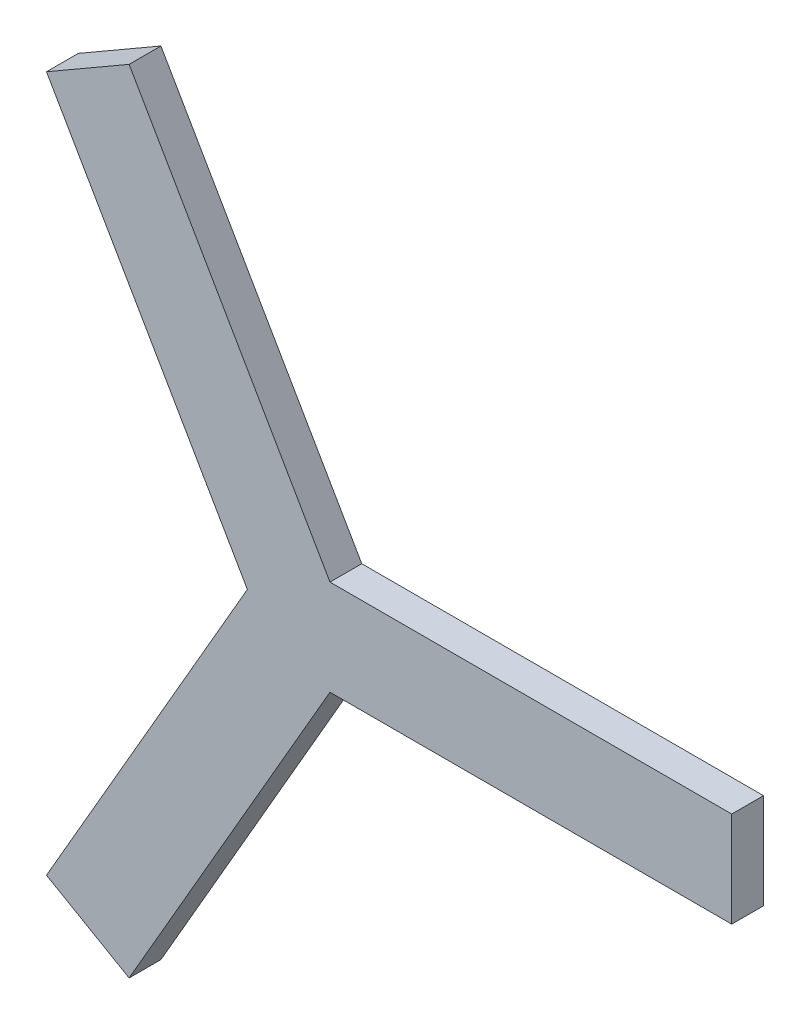
ISO-10303-21;
HEADER;
FILE_DESCRIPTION(('STEP AP214'),'2;1');
FILE_NAME('part.step','',(''),(''),'','','');
FILE_SCHEMA(('AUTOMOTIVE_DESIGN { 1 0 10303 214 1 1 1 1 }'));
ENDSEC;
DATA;
#1=APPLICATION_CONTEXT('core data for automotive mechanical design processes');
#2=APPLICATION_PROTOCOL_DEFINITION('international standard','automotive_design',2000,#1);
#3=PRODUCT_CONTEXT('',#1,'mechanical');
#4=PRODUCT('Part','Part','',(#3));
#5=PRODUCT_RELATED_PRODUCT_CATEGORY('part','',(#4));
#6=PRODUCT_DEFINITION_FORMATION('','',#4);
#7=PRODUCT_DEFINITION_CONTEXT('part definition',#1,'design');
#8=PRODUCT_DEFINITION('design','',#6,#7);
#9=PRODUCT_DEFINITION_SHAPE('','',#8);
#10=(LENGTH_UNIT() NAMED_UNIT(*) SI_UNIT(.MILLI.,.METRE.));
#11=(NAMED_UNIT(*) PLANE_ANGLE_UNIT() SI_UNIT($,.RADIAN.));
#12=(NAMED_UNIT(*) SI_UNIT($,.STERADIAN.) SOLID_ANGLE_UNIT());
#13=UNCERTAINTY_MEASURE_WITH_UNIT(LENGTH_MEASURE(1.E-05),#10,'distance_accuracy_value','');
#14=(GEOMETRIC_REPRESENTATION_CONTEXT(3) GLOBAL_UNCERTAINTY_ASSIGNED_CONTEXT((#13)) GLOBAL_UNIT_ASSIGNED_CONTEXT((#10,
#11,#12)) REPRESENTATION_CONTEXT('',''));
#15=CARTESIAN_POINT('',(0.,0.,0.));
#16=DIRECTION('',(0.,0.,1.));
#17=DIRECTION('',(1.,0.,0.));
#18=AXIS2_PLACEMENT_3D('',#15,#16,#17);
#19=CARTESIAN_POINT('',(-160.980762113534,218.826859021798,20.));
#20=DIRECTION('',(0.866025403784439,0.5,0.));
#21=DIRECTION('',(-0.5,0.866025403784439,0.));
#22=AXIS2_PLACEMENT_3D('',#19,#20,#21);
#23=PLANE('',#22);
#24=DIRECTION('',(0.5,-0.866025403784439,0.));
#25=VECTOR('',#24,1.);
#26=CARTESIAN_POINT('',(-160.980762113534,218.826859021798,0.));
#27=LINE('',#26,#25);
#28=CARTESIAN_POINT('',(-160.980762113534,218.826859021798,0.));
#29=VERTEX_POINT('',#28);
#30=CARTESIAN_POINT('',(-34.6410161513768,-3.69149155687865E-12,0.));
#31=VERTEX_POINT('',#30);
#32=EDGE_CURVE('E139',#29,#31,#27,.T.);
#33=ORIENTED_EDGE('',*,*,#32,.T.);
#34=DIRECTION('',(0.,0.,-1.));
#35=VECTOR('',#34,1.);
#36=CARTESIAN_POINT('',(-34.6410161513768,-3.69149155687865E-12,20.));
#37=LINE('',#36,#35);
#38=CARTESIAN_POINT('',(-34.6410161513768,-3.69149155687865E-12,20.));
#39=VERTEX_POINT('',#38);
#40=EDGE_CURVE('E11',#39,#31,#37,.T.);
#41=ORIENTED_EDGE('',*,*,#40,.F.);
#42=DIRECTION('',(0.5,-0.866025403784439,0.));
#43=VECTOR('',#42,1.);
#44=CARTESIAN_POINT('',(-160.980762113534,218.826859021798,20.));
#45=LINE('',#44,#43);
#46=CARTESIAN_POINT('',(-160.980762113534,218.826859021798,20.));
#47=VERTEX_POINT('',#46);
#48=EDGE_CURVE('E155',#47,#39,#45,.T.);
#49=ORIENTED_EDGE('',*,*,#48,.F.);
#50=DIRECTION('',(0.,0.,-1.));
#51=VECTOR('',#50,1.);
#52=CARTESIAN_POINT('',(-160.980762113534,218.826859021798,20.));
#53=LINE('',#52,#51);
#54=EDGE_CURVE('E135',#47,#29,#53,.T.);
#55=ORIENTED_EDGE('',*,*,#54,.T.);
#56=EDGE_LOOP('',(#33,#41,#49,#55));
#57=FACE_BOUND('',#56,.T.);
#58=ADVANCED_FACE('F37',(#57),#23,.F.);
#59=CARTESIAN_POINT('',(-160.980762113531,-218.826859021799,20.));
#60=DIRECTION('',(0.866025403784439,-0.5,0.));
#61=DIRECTION('',(0.5,0.866025403784439,0.));
#62=AXIS2_PLACEMENT_3D('',#59,#60,#61);
#63=PLANE('',#62);
#64=DIRECTION('',(-0.5,-0.866025403784439,0.));
#65=VECTOR('',#64,1.);
#66=CARTESIAN_POINT('',(-160.980762113531,-218.826859021799,0.));
#67=LINE('',#66,#65);
#68=CARTESIAN_POINT('',(-160.980762113531,-218.826859021799,0.));
#69=VERTEX_POINT('',#68);
#70=EDGE_CURVE('E142',#31,#69,#67,.T.);
#71=ORIENTED_EDGE('',*,*,#70,.T.);
#72=DIRECTION('',(0.,0.,-1.));
#73=VECTOR('',#72,1.);
#74=CARTESIAN_POINT('',(-160.980762113531,-218.826859021799,20.));
#75=LINE('',#74,#73);
#76=CARTESIAN_POINT('',(-160.980762113531,-218.826859021799,20.));
#77=VERTEX_POINT('',#76);
#78=EDGE_CURVE('E45',#77,#69,#75,.T.);
#79=ORIENTED_EDGE('',*,*,#78,.F.);
#80=DIRECTION('',(-0.5,-0.866025403784439,0.));
#81=VECTOR('',#80,1.);
#82=CARTESIAN_POINT('',(-160.980762113531,-218.826859021799,20.));
#83=LINE('',#82,#81);
#84=EDGE_CURVE('E99',#39,#77,#83,.T.);
#85=ORIENTED_EDGE('',*,*,#84,.F.);
#86=ORIENTED_EDGE('',*,*,#40,.T.);
#87=EDGE_LOOP('',(#71,#79,#85,#86));
#88=FACE_BOUND('',#87,.T.);
#89=ADVANCED_FACE('F198',(#88),#63,.F.);
#90=CARTESIAN_POINT('',(-109.019237886465,-248.826859021799,20.));
#91=DIRECTION('',(0.5,0.866025403784439,0.));
#92=DIRECTION('',(-0.866025403784439,0.5,0.));
#93=AXIS2_PLACEMENT_3D('',#90,#91,#92);
#94=PLANE('',#93);
#95=DIRECTION('',(0.866025403784439,-0.5,0.));
#96=VECTOR('',#95,1.);
#97=CARTESIAN_POINT('',(-109.019237886465,-248.826859021799,0.));
#98=LINE('',#97,#96);
#99=CARTESIAN_POINT('',(-109.019237886465,-248.826859021799,0.));
#100=VERTEX_POINT('',#99);
#101=EDGE_CURVE('E144',#69,#100,#98,.T.);
#102=ORIENTED_EDGE('',*,*,#101,.T.);
#103=DIRECTION('',(0.,0.,-1.));
#104=VECTOR('',#103,1.);
#105=CARTESIAN_POINT('',(-109.019237886465,-248.826859021799,20.));
#106=LINE('',#105,#104);
#107=CARTESIAN_POINT('',(-109.019237886465,-248.826859021799,20.));
#108=VERTEX_POINT('',#107);
#109=EDGE_CURVE('E165',#108,#100,#106,.T.);
#110=ORIENTED_EDGE('',*,*,#109,.F.);
#111=DIRECTION('',(0.866025403784439,-0.5,0.));
#112=VECTOR('',#111,1.);
#113=CARTESIAN_POINT('',(-109.019237886465,-248.826859021799,20.));
#114=LINE('',#113,#112);
#115=EDGE_CURVE('E173',#77,#108,#114,.T.);
#116=ORIENTED_EDGE('',*,*,#115,.F.);
#117=ORIENTED_EDGE('',*,*,#78,.T.);
#118=EDGE_LOOP('',(#102,#110,#116,#117));
#119=FACE_BOUND('',#118,.T.);
#120=ADVANCED_FACE('F171',(#119),#94,.F.);
#121=CARTESIAN_POINT('',(-109.019237886465,-248.826859021799,20.));
#122=DIRECTION('',(-0.866025403784439,0.5,0.));
#123=DIRECTION('',(-0.5,-0.866025403784439,0.));
#124=AXIS2_PLACEMENT_3D('',#121,#122,#123);
#125=PLANE('',#124);
#126=DIRECTION('',(0.5,0.866025403784439,0.));
#127=VECTOR('',#126,1.);
#128=CARTESIAN_POINT('',(-109.019237886465,-248.826859021799,0.));
#129=LINE('',#128,#127);
#130=CARTESIAN_POINT('',(17.3205080756916,-30.,0.));
#131=VERTEX_POINT('',#130);
#132=EDGE_CURVE('E146',#100,#131,#129,.T.);
#133=ORIENTED_EDGE('',*,*,#132,.T.);
#134=DIRECTION('',(0.,0.,-1.));
#135=VECTOR('',#134,1.);
#136=CARTESIAN_POINT('',(17.3205080756916,-30.,20.));
#137=LINE('',#136,#135);
#138=CARTESIAN_POINT('',(17.3205080756916,-30.,20.));
#139=VERTEX_POINT('',#138);
#140=EDGE_CURVE('E162',#139,#131,#137,.T.);
#141=ORIENTED_EDGE('',*,*,#140,.F.);
#142=DIRECTION('',(0.5,0.866025403784439,0.));
#143=VECTOR('',#142,1.);
#144=CARTESIAN_POINT('',(-109.019237886465,-248.826859021799,20.));
#145=LINE('',#144,#143);
#146=EDGE_CURVE('E189',#108,#139,#145,.T.);
#147=ORIENTED_EDGE('',*,*,#146,.F.);
#148=ORIENTED_EDGE('',*,*,#109,.T.);
#149=EDGE_LOOP('',(#133,#141,#147,#148));
#150=FACE_BOUND('',#149,.T.);
#151=ADVANCED_FACE('F182',(#150),#125,.F.);
#152=CARTESIAN_POINT('',(270.,-30.,20.));
#153=DIRECTION('',(0.,1.,0.));
#154=DIRECTION('',(-1.,0.,0.));
#155=AXIS2_PLACEMENT_3D('',#152,#153,#154);
#156=PLANE('',#155);
#157=DIRECTION('',(1.,0.,0.));
#158=VECTOR('',#157,1.);
#159=CARTESIAN_POINT('',(270.,-30.,0.));
#160=LINE('',#159,#158);
#161=CARTESIAN_POINT('',(270.,-30.,0.));
#162=VERTEX_POINT('',#161);
#163=EDGE_CURVE('E148',#131,#162,#160,.T.);
#164=ORIENTED_EDGE('',*,*,#163,.T.);
#165=DIRECTION('',(0.,0.,-1.));
#166=VECTOR('',#165,1.);
#167=CARTESIAN_POINT('',(270.,-30.,20.));
#168=LINE('',#167,#166);
#169=CARTESIAN_POINT('',(270.,-30.,20.));
#170=VERTEX_POINT('',#169);
#171=EDGE_CURVE('E159',#170,#162,#168,.T.);
#172=ORIENTED_EDGE('',*,*,#171,.F.);
#173=DIRECTION('',(1.,0.,0.));
#174=VECTOR('',#173,1.);
#175=CARTESIAN_POINT('',(270.,-30.,20.));
#176=LINE('',#175,#174);
#177=EDGE_CURVE('E188',#139,#170,#176,.T.);
#178=ORIENTED_EDGE('',*,*,#177,.F.);
#179=ORIENTED_EDGE('',*,*,#140,.T.);
#180=EDGE_LOOP('',(#164,#172,#178,#179));
#181=FACE_BOUND('',#180,.T.);
#182=ADVANCED_FACE('F186',(#181),#156,.F.);
#183=CARTESIAN_POINT('',(270.,30.,20.));
#184=DIRECTION('',(-1.,0.,0.));
#185=DIRECTION('',(0.,0.,1.));
#186=AXIS2_PLACEMENT_3D('',#183,#184,#185);
#187=PLANE('',#186);
#188=DIRECTION('',(0.,1.,0.));
#189=VECTOR('',#188,1.);
#190=CARTESIAN_POINT('',(270.,30.,0.));
#191=LINE('',#190,#189);
#192=CARTESIAN_POINT('',(270.,30.,0.));
#193=VERTEX_POINT('',#192);
#194=EDGE_CURVE('E150',#162,#193,#191,.T.);
#195=ORIENTED_EDGE('',*,*,#194,.T.);
#196=DIRECTION('',(0.,0.,-1.));
#197=VECTOR('',#196,1.);
#198=CARTESIAN_POINT('',(270.,30.,20.));
#199=LINE('',#198,#197);
#200=CARTESIAN_POINT('',(270.,30.,20.));
#201=VERTEX_POINT('',#200);
#202=EDGE_CURVE('E130',#201,#193,#199,.T.);
#203=ORIENTED_EDGE('',*,*,#202,.F.);
#204=DIRECTION('',(0.,1.,0.));
#205=VECTOR('',#204,1.);
#206=CARTESIAN_POINT('',(270.,30.,20.));
#207=LINE('',#206,#205);
#208=EDGE_CURVE('E121',#170,#201,#207,.T.);
#209=ORIENTED_EDGE('',*,*,#208,.F.);
#210=ORIENTED_EDGE('',*,*,#171,.T.);
#211=EDGE_LOOP('',(#195,#203,#209,#210));
#212=FACE_BOUND('',#211,.T.);
#213=ADVANCED_FACE('F210',(#212),#187,.F.);
#214=CARTESIAN_POINT('',(270.,30.,20.));
#215=DIRECTION('',(0.,-1.,0.));
#216=DIRECTION('',(1.,0.,0.));
#217=AXIS2_PLACEMENT_3D('',#214,#215,#216);
#218=PLANE('',#217);
#219=DIRECTION('',(-1.,0.,0.));
#220=VECTOR('',#219,1.);
#221=CARTESIAN_POINT('',(270.,30.,0.));
#222=LINE('',#221,#220);
#223=CARTESIAN_POINT('',(17.3205080756874,30.,0.));
#224=VERTEX_POINT('',#223);
#225=EDGE_CURVE('E129',#193,#224,#222,.T.);
#226=ORIENTED_EDGE('',*,*,#225,.T.);
#227=DIRECTION('',(0.,0.,-1.));
#228=VECTOR('',#227,1.);
#229=CARTESIAN_POINT('',(17.3205080756874,30.,20.));
#230=LINE('',#229,#228);
#231=CARTESIAN_POINT('',(17.3205080756874,30.,20.));
#232=VERTEX_POINT('',#231);
#233=EDGE_CURVE('E126',#232,#224,#230,.T.);
#234=ORIENTED_EDGE('',*,*,#233,.F.);
#235=DIRECTION('',(-1.,0.,0.));
#236=VECTOR('',#235,1.);
#237=CARTESIAN_POINT('',(270.,30.,20.));
#238=LINE('',#237,#236);
#239=EDGE_CURVE('E115',#201,#232,#238,.T.);
#240=ORIENTED_EDGE('',*,*,#239,.F.);
#241=ORIENTED_EDGE('',*,*,#202,.T.);
#242=EDGE_LOOP('',(#226,#234,#240,#241));
#243=FACE_BOUND('',#242,.T.);
#244=ADVANCED_FACE('F127',(#243),#218,.F.);
#245=CARTESIAN_POINT('',(-109.019237886468,248.826859021798,20.));
#246=DIRECTION('',(-0.866025403784438,-0.5,0.));
#247=DIRECTION('',(0.5,-0.866025403784439,0.));
#248=AXIS2_PLACEMENT_3D('',#245,#246,#247);
#249=PLANE('',#248);
#250=DIRECTION('',(-0.5,0.866025403784438,0.));
#251=VECTOR('',#250,1.);
#252=CARTESIAN_POINT('',(-109.019237886468,248.826859021798,0.));
#253=LINE('',#252,#251);
#254=CARTESIAN_POINT('',(-109.019237886468,248.826859021798,0.));
#255=VERTEX_POINT('',#254);
#256=EDGE_CURVE('E85',#224,#255,#253,.T.);
#257=ORIENTED_EDGE('',*,*,#256,.T.);
#258=DIRECTION('',(0.,0.,-1.));
#259=VECTOR('',#258,1.);
#260=CARTESIAN_POINT('',(-109.019237886468,248.826859021798,20.));
#261=LINE('',#260,#259);
#262=CARTESIAN_POINT('',(-109.019237886468,248.826859021798,20.));
#263=VERTEX_POINT('',#262);
#264=EDGE_CURVE('E131',#263,#255,#261,.T.);
#265=ORIENTED_EDGE('',*,*,#264,.F.);
#266=DIRECTION('',(-0.5,0.866025403784438,0.));
#267=VECTOR('',#266,1.);
#268=CARTESIAN_POINT('',(-109.019237886468,248.826859021798,20.));
#269=LINE('',#268,#267);
#270=EDGE_CURVE('E119',#232,#263,#269,.T.);
#271=ORIENTED_EDGE('',*,*,#270,.F.);
#272=ORIENTED_EDGE('',*,*,#233,.T.);
#273=EDGE_LOOP('',(#257,#265,#271,#272));
#274=FACE_BOUND('',#273,.T.);
#275=ADVANCED_FACE('F133',(#274),#249,.F.);
#276=CARTESIAN_POINT('',(-109.019237886468,248.826859021798,20.));
#277=DIRECTION('',(0.5,-0.866025403784438,0.));
#278=DIRECTION('',(0.866025403784438,0.5,0.));
#279=AXIS2_PLACEMENT_3D('',#276,#277,#278);
#280=PLANE('',#279);
#281=DIRECTION('',(-0.866025403784438,-0.5,0.));
#282=VECTOR('',#281,1.);
#283=CARTESIAN_POINT('',(-109.019237886468,248.826859021798,0.));
#284=LINE('',#283,#282);
#285=EDGE_CURVE('E91',#255,#29,#284,.T.);
#286=ORIENTED_EDGE('',*,*,#285,.T.);
#287=ORIENTED_EDGE('',*,*,#54,.F.);
#288=DIRECTION('',(-0.866025403784438,-0.5,0.));
#289=VECTOR('',#288,1.);
#290=CARTESIAN_POINT('',(-109.019237886468,248.826859021798,20.));
#291=LINE('',#290,#289);
#292=EDGE_CURVE('E53',#263,#47,#291,.T.);
#293=ORIENTED_EDGE('',*,*,#292,.F.);
#294=ORIENTED_EDGE('',*,*,#264,.T.);
#295=EDGE_LOOP('',(#286,#287,#293,#294));
#296=FACE_BOUND('',#295,.T.);
#297=ADVANCED_FACE('F218',(#296),#280,.F.);
#298=CARTESIAN_POINT('',(0.,0.,20.));
#299=DIRECTION('',(0.,0.,-1.));
#300=DIRECTION('',(-1.,0.,0.));
#301=AXIS2_PLACEMENT_3D('',#298,#299,#300);
#302=PLANE('',#301);
#303=ORIENTED_EDGE('',*,*,#48,.T.);
#304=ORIENTED_EDGE('',*,*,#84,.T.);
#305=ORIENTED_EDGE('',*,*,#115,.T.);
#306=ORIENTED_EDGE('',*,*,#146,.T.);
#307=ORIENTED_EDGE('',*,*,#177,.T.);
#308=ORIENTED_EDGE('',*,*,#208,.T.);
#309=ORIENTED_EDGE('',*,*,#239,.T.);
#310=ORIENTED_EDGE('',*,*,#270,.T.);
#311=ORIENTED_EDGE('',*,*,#292,.T.);
#312=EDGE_LOOP('',(#303,#304,#305,#306,#307,#308,#309,#310,#311));
#313=FACE_BOUND('',#312,.T.);
#314=ADVANCED_FACE('F117',(#313),#302,.F.);
#315=CARTESIAN_POINT('',(0.,0.,0.));
#316=DIRECTION('',(0.,0.,-1.));
#317=DIRECTION('',(-1.,0.,0.));
#318=AXIS2_PLACEMENT_3D('',#315,#316,#317);
#319=PLANE('',#318);
#320=ORIENTED_EDGE('',*,*,#32,.F.);
#321=ORIENTED_EDGE('',*,*,#285,.F.);
#322=ORIENTED_EDGE('',*,*,#256,.F.);
#323=ORIENTED_EDGE('',*,*,#225,.F.);
#324=ORIENTED_EDGE('',*,*,#194,.F.);
#325=ORIENTED_EDGE('',*,*,#163,.F.);
#326=ORIENTED_EDGE('',*,*,#132,.F.);
#327=ORIENTED_EDGE('',*,*,#101,.F.);
#328=ORIENTED_EDGE('',*,*,#70,.F.);
#329=EDGE_LOOP('',(#320,#321,#322,#323,#324,#325,#326,#327,#328));
#330=FACE_BOUND('',#329,.T.);
#331=ADVANCED_FACE('F177',(#330),#319,.T.);
#332=CLOSED_SHELL('',(#58,#89,#120,#151,#182,#213,#244,#275,#297,#314,#331));
#333=MANIFOLD_SOLID_BREP('B2',#332);
#334=ADVANCED_BREP_SHAPE_REPRESENTATION('',(#18,#333),#14);
#335=SHAPE_DEFINITION_REPRESENTATION(#9,#334);
ENDSEC;
END-ISO-10303-21;
